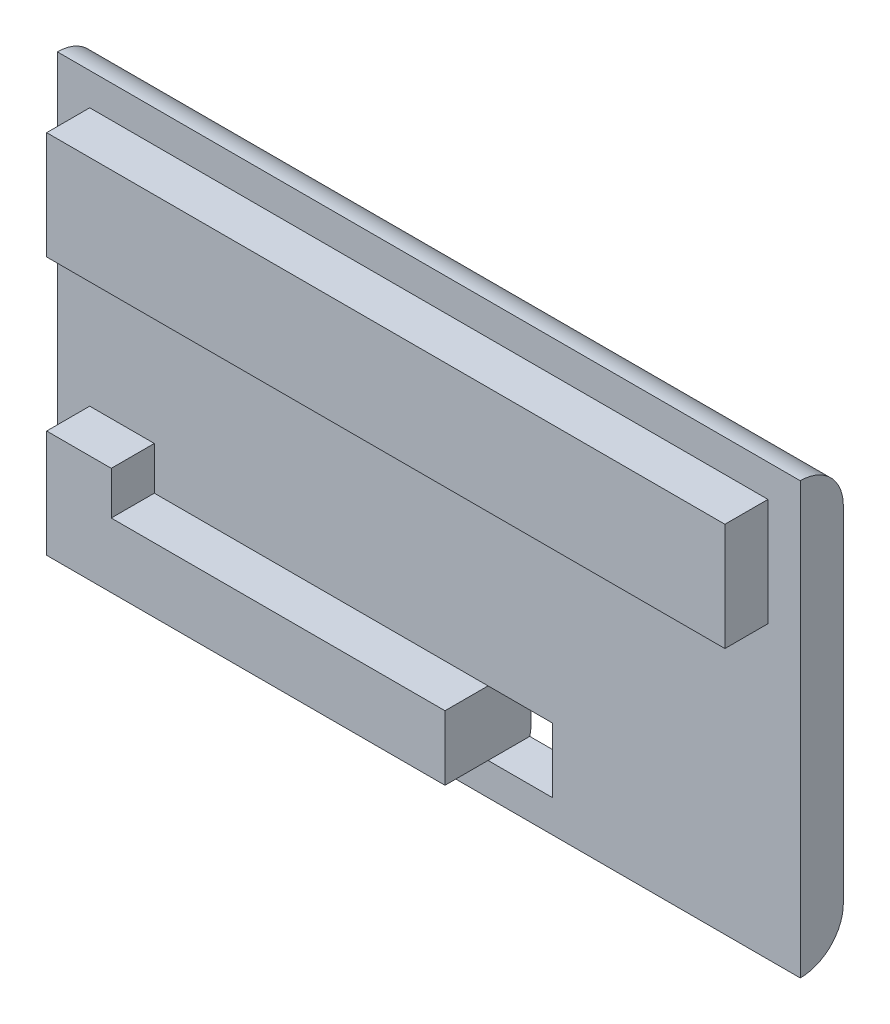
ISO-10303-21;
HEADER;
FILE_DESCRIPTION(('STEP AP214'),'2;1');
FILE_NAME('part.step','',(''),(''),'','','');
FILE_SCHEMA(('AUTOMOTIVE_DESIGN { 1 0 10303 214 1 1 1 1 }'));
ENDSEC;
DATA;
#1=APPLICATION_CONTEXT('core data for automotive mechanical design processes');
#2=APPLICATION_PROTOCOL_DEFINITION('international standard','automotive_design',2000,#1);
#3=PRODUCT_CONTEXT('',#1,'mechanical');
#4=PRODUCT('Part','Part','',(#3));
#5=PRODUCT_RELATED_PRODUCT_CATEGORY('part','',(#4));
#6=PRODUCT_DEFINITION_FORMATION('','',#4);
#7=PRODUCT_DEFINITION_CONTEXT('part definition',#1,'design');
#8=PRODUCT_DEFINITION('design','',#6,#7);
#9=PRODUCT_DEFINITION_SHAPE('','',#8);
#10=(LENGTH_UNIT() NAMED_UNIT(*) SI_UNIT(.MILLI.,.METRE.));
#11=(NAMED_UNIT(*) PLANE_ANGLE_UNIT() SI_UNIT($,.RADIAN.));
#12=(NAMED_UNIT(*) SI_UNIT($,.STERADIAN.) SOLID_ANGLE_UNIT());
#13=UNCERTAINTY_MEASURE_WITH_UNIT(LENGTH_MEASURE(1.E-05),#10,'distance_accuracy_value','');
#14=(GEOMETRIC_REPRESENTATION_CONTEXT(3) GLOBAL_UNCERTAINTY_ASSIGNED_CONTEXT((#13)) GLOBAL_UNIT_ASSIGNED_CONTEXT((#10,
#11,#12)) REPRESENTATION_CONTEXT('',''));
#15=CARTESIAN_POINT('',(0.,0.,0.));
#16=DIRECTION('',(0.,0.,1.));
#17=DIRECTION('',(1.,0.,0.));
#18=AXIS2_PLACEMENT_3D('',#15,#16,#17);
#19=CARTESIAN_POINT('',(5.75,-8.5,10.));
#20=DIRECTION('',(1.,0.,0.));
#21=DIRECTION('',(0.,1.,0.));
#22=AXIS2_PLACEMENT_3D('',#19,#20,#21);
#23=PLANE('',#22);
#24=DIRECTION('',(0.,-1.,0.));
#25=VECTOR('',#24,1.);
#26=CARTESIAN_POINT('',(5.75,-8.5,2.));
#27=LINE('',#26,#25);
#28=CARTESIAN_POINT('',(5.75,-5.5,2.));
#29=VERTEX_POINT('',#28);
#30=CARTESIAN_POINT('',(5.75,-8.5,2.));
#31=VERTEX_POINT('',#30);
#32=EDGE_CURVE('E189',#29,#31,#27,.T.);
#33=ORIENTED_EDGE('',*,*,#32,.F.);
#34=DIRECTION('',(0.,0.,-1.));
#35=VECTOR('',#34,1.);
#36=CARTESIAN_POINT('',(5.75,-5.5,10.));
#37=LINE('',#36,#35);
#38=CARTESIAN_POINT('',(5.75,-5.5,0.));
#39=VERTEX_POINT('',#38);
#40=EDGE_CURVE('E498',#29,#39,#37,.T.);
#41=ORIENTED_EDGE('',*,*,#40,.T.);
#42=DIRECTION('',(0.,-1.,0.));
#43=VECTOR('',#42,1.);
#44=CARTESIAN_POINT('',(5.75,-8.5,0.));
#45=LINE('',#44,#43);
#46=CARTESIAN_POINT('',(5.75,-8.,0.));
#47=VERTEX_POINT('',#46);
#48=EDGE_CURVE('E513',#39,#47,#45,.T.);
#49=ORIENTED_EDGE('',*,*,#48,.T.);
#50=CARTESIAN_POINT('',(5.75,-8.,2.));
#51=DIRECTION('',(1.,0.,0.));
#52=DIRECTION('',(0.,1.,0.));
#53=AXIS2_PLACEMENT_3D('',#50,#51,#52);
#54=CIRCLE('',#53,2.);
#55=CARTESIAN_POINT('',(5.75,-8.5,0.0635083268962899));
#56=VERTEX_POINT('',#55);
#57=EDGE_CURVE('E263',#47,#56,#54,.F.);
#58=ORIENTED_EDGE('',*,*,#57,.T.);
#59=DIRECTION('',(0.,0.,-1.));
#60=VECTOR('',#59,1.);
#61=CARTESIAN_POINT('',(5.75,-8.5,10.));
#62=LINE('',#61,#60);
#63=EDGE_CURVE('E493',#31,#56,#62,.T.);
#64=ORIENTED_EDGE('',*,*,#63,.F.);
#65=EDGE_LOOP('',(#33,#41,#49,#58,#64));
#66=FACE_BOUND('',#65,.T.);
#67=ADVANCED_FACE('F45',(#66),#23,.F.);
#68=CARTESIAN_POINT('',(5.75,-5.5,10.));
#69=DIRECTION('',(0.,1.,0.));
#70=DIRECTION('',(0.,0.,1.));
#71=AXIS2_PLACEMENT_3D('',#68,#69,#70);
#72=PLANE('',#71);
#73=DIRECTION('',(1.,0.,0.));
#74=VECTOR('',#73,1.);
#75=CARTESIAN_POINT('',(5.75,-5.5,2.));
#76=LINE('',#75,#74);
#77=CARTESIAN_POINT('',(2.75,-5.5,2.));
#78=VERTEX_POINT('',#77);
#79=EDGE_CURVE('E11',#78,#29,#76,.T.);
#80=ORIENTED_EDGE('',*,*,#79,.F.);
#81=DIRECTION('',(0.,0.,-1.));
#82=VECTOR('',#81,1.);
#83=CARTESIAN_POINT('',(2.75,-5.5,10.));
#84=LINE('',#83,#82);
#85=CARTESIAN_POINT('',(2.75,-5.5,0.));
#86=VERTEX_POINT('',#85);
#87=EDGE_CURVE('E519',#78,#86,#84,.T.);
#88=ORIENTED_EDGE('',*,*,#87,.T.);
#89=DIRECTION('',(1.,0.,0.));
#90=VECTOR('',#89,1.);
#91=CARTESIAN_POINT('',(5.75,-5.5,0.));
#92=LINE('',#91,#90);
#93=EDGE_CURVE('E508',#86,#39,#92,.T.);
#94=ORIENTED_EDGE('',*,*,#93,.T.);
#95=ORIENTED_EDGE('',*,*,#40,.F.);
#96=EDGE_LOOP('',(#80,#88,#94,#95));
#97=FACE_BOUND('',#96,.T.);
#98=ADVANCED_FACE('F308',(#97),#72,.F.);
#99=CARTESIAN_POINT('',(-15.75,-8.5,4.));
#100=DIRECTION('',(0.,1.,0.));
#101=DIRECTION('',(0.,0.,1.));
#102=AXIS2_PLACEMENT_3D('',#99,#100,#101);
#103=PLANE('',#102);
#104=DIRECTION('',(1.,0.,0.));
#105=VECTOR('',#104,1.);
#106=CARTESIAN_POINT('',(-15.75,-8.5,2.));
#107=LINE('',#106,#105);
#108=CARTESIAN_POINT('',(-15.75,-8.5,2.));
#109=VERTEX_POINT('',#108);
#110=CARTESIAN_POINT('',(2.75,-8.5,2.));
#111=VERTEX_POINT('',#110);
#112=EDGE_CURVE('E205',#109,#111,#107,.T.);
#113=ORIENTED_EDGE('',*,*,#112,.T.);
#114=DIRECTION('',(0.,0.,-1.));
#115=VECTOR('',#114,1.);
#116=CARTESIAN_POINT('',(2.75,-8.5,10.));
#117=LINE('',#116,#115);
#118=CARTESIAN_POINT('',(2.75,-8.5,4.));
#119=VERTEX_POINT('',#118);
#120=EDGE_CURVE('E521',#119,#111,#117,.T.);
#121=ORIENTED_EDGE('',*,*,#120,.F.);
#122=DIRECTION('',(1.,0.,0.));
#123=VECTOR('',#122,1.);
#124=CARTESIAN_POINT('',(-15.75,-8.5,4.));
#125=LINE('',#124,#123);
#126=CARTESIAN_POINT('',(-15.75,-8.5,4.));
#127=VERTEX_POINT('',#126);
#128=EDGE_CURVE('E209',#127,#119,#125,.T.);
#129=ORIENTED_EDGE('',*,*,#128,.F.);
#130=DIRECTION('',(0.,0.,-1.));
#131=VECTOR('',#130,1.);
#132=CARTESIAN_POINT('',(-15.75,-8.5,4.));
#133=LINE('',#132,#131);
#134=EDGE_CURVE('E214',#127,#109,#133,.T.);
#135=ORIENTED_EDGE('',*,*,#134,.T.);
#136=EDGE_LOOP('',(#113,#121,#129,#135));
#137=FACE_BOUND('',#136,.T.);
#138=ADVANCED_FACE('F314',(#137),#103,.F.);
#139=CARTESIAN_POINT('',(0.,0.,2.));
#140=DIRECTION('',(0.,0.,1.));
#141=DIRECTION('',(1.,0.,0.));
#142=AXIS2_PLACEMENT_3D('',#139,#140,#141);
#143=PLANE('',#142);
#144=DIRECTION('',(-1.,0.,0.));
#145=VECTOR('',#144,1.);
#146=CARTESIAN_POINT('',(-15.75,-3.5,2.));
#147=LINE('',#146,#145);
#148=CARTESIAN_POINT('',(-12.75,-3.5,2.));
#149=VERTEX_POINT('',#148);
#150=CARTESIAN_POINT('',(-15.75,-3.5,2.));
#151=VERTEX_POINT('',#150);
#152=EDGE_CURVE('E185',#149,#151,#147,.T.);
#153=ORIENTED_EDGE('',*,*,#152,.F.);
#154=DIRECTION('',(0.,-1.,0.));
#155=VECTOR('',#154,1.);
#156=CARTESIAN_POINT('',(-12.75,-3.5,2.));
#157=LINE('',#156,#155);
#158=CARTESIAN_POINT('',(-12.75,-5.5,2.));
#159=VERTEX_POINT('',#158);
#160=EDGE_CURVE('E170',#149,#159,#157,.T.);
#161=ORIENTED_EDGE('',*,*,#160,.T.);
#162=DIRECTION('',(1.,0.,0.));
#163=VECTOR('',#162,1.);
#164=CARTESIAN_POINT('',(-12.75,-5.5,2.));
#165=LINE('',#164,#163);
#166=EDGE_CURVE('E60',#159,#78,#165,.T.);
#167=ORIENTED_EDGE('',*,*,#166,.T.);
#168=ORIENTED_EDGE('',*,*,#79,.T.);
#169=ORIENTED_EDGE('',*,*,#32,.T.);
#170=DIRECTION('',(1.,0.,0.));
#171=VECTOR('',#170,1.);
#172=CARTESIAN_POINT('',(0.,-8.5,2.));
#173=LINE('',#172,#171);
#174=EDGE_CURVE('E495',#111,#31,#173,.T.);
#175=ORIENTED_EDGE('',*,*,#174,.F.);
#176=ORIENTED_EDGE('',*,*,#112,.F.);
#177=DIRECTION('',(0.,-1.,0.));
#178=VECTOR('',#177,1.);
#179=CARTESIAN_POINT('',(-15.75,-8.5,2.));
#180=LINE('',#179,#178);
#181=EDGE_CURVE('E196',#151,#109,#180,.T.);
#182=ORIENTED_EDGE('',*,*,#181,.F.);
#183=EDGE_LOOP('',(#153,#161,#167,#168,#169,#175,#176,#182));
#184=FACE_BOUND('',#183,.T.);
#185=DIRECTION('',(0.,1.,0.));
#186=VECTOR('',#185,1.);
#187=CARTESIAN_POINT('',(17.25,10.,2.));
#188=LINE('',#187,#186);
#189=CARTESIAN_POINT('',(17.25,-10.,2.));
#190=VERTEX_POINT('',#189);
#191=CARTESIAN_POINT('',(17.25,10.,2.));
#192=VERTEX_POINT('',#191);
#193=EDGE_CURVE('E219',#190,#192,#188,.T.);
#194=ORIENTED_EDGE('',*,*,#193,.T.);
#195=DIRECTION('',(-1.,0.,0.));
#196=VECTOR('',#195,1.);
#197=CARTESIAN_POINT('',(-17.25,10.,2.));
#198=LINE('',#197,#196);
#199=CARTESIAN_POINT('',(-17.25,10.,2.));
#200=VERTEX_POINT('',#199);
#201=EDGE_CURVE('E223',#192,#200,#198,.T.);
#202=ORIENTED_EDGE('',*,*,#201,.T.);
#203=DIRECTION('',(0.,-1.,0.));
#204=VECTOR('',#203,1.);
#205=CARTESIAN_POINT('',(-17.25,10.,2.));
#206=LINE('',#205,#204);
#207=CARTESIAN_POINT('',(-17.25,-10.,2.));
#208=VERTEX_POINT('',#207);
#209=EDGE_CURVE('E228',#200,#208,#206,.T.);
#210=ORIENTED_EDGE('',*,*,#209,.T.);
#211=DIRECTION('',(1.,0.,0.));
#212=VECTOR('',#211,1.);
#213=CARTESIAN_POINT('',(-17.25,-10.,2.));
#214=LINE('',#213,#212);
#215=EDGE_CURVE('E232',#208,#190,#214,.T.);
#216=ORIENTED_EDGE('',*,*,#215,.T.);
#217=EDGE_LOOP('',(#194,#202,#210,#216));
#218=FACE_BOUND('',#217,.T.);
#219=DIRECTION('',(0.,-1.,0.));
#220=VECTOR('',#219,1.);
#221=CARTESIAN_POINT('',(-15.75,8.5,2.));
#222=LINE('',#221,#220);
#223=CARTESIAN_POINT('',(-15.75,8.5,2.));
#224=VERTEX_POINT('',#223);
#225=CARTESIAN_POINT('',(-15.75,3.5,2.));
#226=VERTEX_POINT('',#225);
#227=EDGE_CURVE('E203',#224,#226,#222,.T.);
#228=ORIENTED_EDGE('',*,*,#227,.F.);
#229=DIRECTION('',(-1.,0.,0.));
#230=VECTOR('',#229,1.);
#231=CARTESIAN_POINT('',(-15.75,8.5,2.));
#232=LINE('',#231,#230);
#233=CARTESIAN_POINT('',(15.75,8.5,2.));
#234=VERTEX_POINT('',#233);
#235=EDGE_CURVE('E198',#234,#224,#232,.T.);
#236=ORIENTED_EDGE('',*,*,#235,.F.);
#237=DIRECTION('',(0.,1.,0.));
#238=VECTOR('',#237,1.);
#239=CARTESIAN_POINT('',(15.75,8.5,2.));
#240=LINE('',#239,#238);
#241=CARTESIAN_POINT('',(15.75,3.5,2.));
#242=VERTEX_POINT('',#241);
#243=EDGE_CURVE('E536',#242,#234,#240,.T.);
#244=ORIENTED_EDGE('',*,*,#243,.F.);
#245=DIRECTION('',(1.,0.,0.));
#246=VECTOR('',#245,1.);
#247=CARTESIAN_POINT('',(-15.75,3.5,2.));
#248=LINE('',#247,#246);
#249=EDGE_CURVE('E548',#226,#242,#248,.T.);
#250=ORIENTED_EDGE('',*,*,#249,.F.);
#251=EDGE_LOOP('',(#228,#236,#244,#250));
#252=FACE_BOUND('',#251,.T.);
#253=ADVANCED_FACE('F192',(#184,#218,#252),#143,.T.);
#254=CARTESIAN_POINT('',(17.25,10.,2.));
#255=DIRECTION('',(-1.,0.,0.));
#256=DIRECTION('',(0.,0.,1.));
#257=AXIS2_PLACEMENT_3D('',#254,#255,#256);
#258=PLANE('',#257);
#259=ORIENTED_EDGE('',*,*,#193,.F.);
#260=CARTESIAN_POINT('',(17.25,-8.,2.));
#261=DIRECTION('',(-1.,0.,0.));
#262=DIRECTION('',(0.,0.,1.));
#263=AXIS2_PLACEMENT_3D('',#260,#261,#262);
#264=CIRCLE('',#263,2.);
#265=CARTESIAN_POINT('',(17.25,-8.00000000000001,0.));
#266=VERTEX_POINT('',#265);
#267=EDGE_CURVE('E251',#190,#266,#264,.F.);
#268=ORIENTED_EDGE('',*,*,#267,.T.);
#269=DIRECTION('',(0.,1.,0.));
#270=VECTOR('',#269,1.);
#271=CARTESIAN_POINT('',(17.25,10.,0.));
#272=LINE('',#271,#270);
#273=CARTESIAN_POINT('',(17.25,8.,0.));
#274=VERTEX_POINT('',#273);
#275=EDGE_CURVE('E237',#266,#274,#272,.T.);
#276=ORIENTED_EDGE('',*,*,#275,.T.);
#277=CARTESIAN_POINT('',(17.25,8.,2.));
#278=DIRECTION('',(-1.,0.,0.));
#279=DIRECTION('',(0.,0.,1.));
#280=AXIS2_PLACEMENT_3D('',#277,#278,#279);
#281=CIRCLE('',#280,2.);
#282=EDGE_CURVE('E248',#274,#192,#281,.F.);
#283=ORIENTED_EDGE('',*,*,#282,.T.);
#284=EDGE_LOOP('',(#259,#268,#276,#283));
#285=FACE_BOUND('',#284,.T.);
#286=ADVANCED_FACE('F290',(#285),#258,.F.);
#287=CARTESIAN_POINT('',(-17.25,10.,2.));
#288=DIRECTION('',(1.,0.,0.));
#289=DIRECTION('',(0.,0.,-1.));
#290=AXIS2_PLACEMENT_3D('',#287,#288,#289);
#291=PLANE('',#290);
#292=DIRECTION('',(0.,-1.,0.));
#293=VECTOR('',#292,1.);
#294=CARTESIAN_POINT('',(-17.25,10.,0.));
#295=LINE('',#294,#293);
#296=CARTESIAN_POINT('',(-17.25,8.,0.));
#297=VERTEX_POINT('',#296);
#298=CARTESIAN_POINT('',(-17.25,-8.00000000000001,0.));
#299=VERTEX_POINT('',#298);
#300=EDGE_CURVE('E224',#297,#299,#295,.T.);
#301=ORIENTED_EDGE('',*,*,#300,.T.);
#302=CARTESIAN_POINT('',(-17.25,-8.,2.));
#303=DIRECTION('',(1.,0.,0.));
#304=DIRECTION('',(0.,0.,-1.));
#305=AXIS2_PLACEMENT_3D('',#302,#303,#304);
#306=CIRCLE('',#305,2.);
#307=EDGE_CURVE('E54',#299,#208,#306,.F.);
#308=ORIENTED_EDGE('',*,*,#307,.T.);
#309=ORIENTED_EDGE('',*,*,#209,.F.);
#310=CARTESIAN_POINT('',(-17.25,8.,2.));
#311=DIRECTION('',(1.,0.,0.));
#312=DIRECTION('',(0.,0.,-1.));
#313=AXIS2_PLACEMENT_3D('',#310,#311,#312);
#314=CIRCLE('',#313,2.);
#315=EDGE_CURVE('E271',#200,#297,#314,.F.);
#316=ORIENTED_EDGE('',*,*,#315,.T.);
#317=EDGE_LOOP('',(#301,#308,#309,#316));
#318=FACE_BOUND('',#317,.T.);
#319=ADVANCED_FACE('F277',(#318),#291,.F.);
#320=CARTESIAN_POINT('',(0.,0.,0.));
#321=DIRECTION('',(0.,0.,1.));
#322=DIRECTION('',(1.,0.,0.));
#323=AXIS2_PLACEMENT_3D('',#320,#321,#322);
#324=PLANE('',#323);
#325=ORIENTED_EDGE('',*,*,#275,.F.);
#326=DIRECTION('',(1.,0.,0.));
#327=VECTOR('',#326,1.);
#328=CARTESIAN_POINT('',(0.,-8.,0.));
#329=LINE('',#328,#327);
#330=EDGE_CURVE('E260',#266,#47,#329,.F.);
#331=ORIENTED_EDGE('',*,*,#330,.T.);
#332=ORIENTED_EDGE('',*,*,#48,.F.);
#333=ORIENTED_EDGE('',*,*,#93,.F.);
#334=DIRECTION('',(0.,1.,0.));
#335=VECTOR('',#334,1.);
#336=CARTESIAN_POINT('',(2.75,-8.5,0.));
#337=LINE('',#336,#335);
#338=CARTESIAN_POINT('',(2.75,-8.,0.));
#339=VERTEX_POINT('',#338);
#340=EDGE_CURVE('E504',#339,#86,#337,.T.);
#341=ORIENTED_EDGE('',*,*,#340,.F.);
#342=DIRECTION('',(1.,0.,0.));
#343=VECTOR('',#342,1.);
#344=CARTESIAN_POINT('',(0.,-8.,0.));
#345=LINE('',#344,#343);
#346=EDGE_CURVE('E257',#339,#299,#345,.F.);
#347=ORIENTED_EDGE('',*,*,#346,.T.);
#348=ORIENTED_EDGE('',*,*,#300,.F.);
#349=DIRECTION('',(-1.,0.,0.));
#350=VECTOR('',#349,1.);
#351=CARTESIAN_POINT('',(0.,8.,0.));
#352=LINE('',#351,#350);
#353=EDGE_CURVE('E254',#297,#274,#352,.F.);
#354=ORIENTED_EDGE('',*,*,#353,.T.);
#355=EDGE_LOOP('',(#325,#331,#332,#333,#341,#347,#348,#354));
#356=FACE_BOUND('',#355,.T.);
#357=ADVANCED_FACE('F293',(#356),#324,.F.);
#358=CARTESIAN_POINT('',(-15.75,-3.5,4.));
#359=DIRECTION('',(0.,-1.,0.));
#360=DIRECTION('',(0.,0.,-1.));
#361=AXIS2_PLACEMENT_3D('',#358,#359,#360);
#362=PLANE('',#361);
#363=DIRECTION('',(-1.,0.,0.));
#364=VECTOR('',#363,1.);
#365=CARTESIAN_POINT('',(-15.75,-3.5,4.));
#366=LINE('',#365,#364);
#367=CARTESIAN_POINT('',(-12.75,-3.5,4.));
#368=VERTEX_POINT('',#367);
#369=CARTESIAN_POINT('',(-15.75,-3.5,4.));
#370=VERTEX_POINT('',#369);
#371=EDGE_CURVE('E187',#368,#370,#366,.T.);
#372=ORIENTED_EDGE('',*,*,#371,.F.);
#373=DIRECTION('',(0.,0.,1.));
#374=VECTOR('',#373,1.);
#375=CARTESIAN_POINT('',(-12.75,-3.5,2.));
#376=LINE('',#375,#374);
#377=EDGE_CURVE('E174',#149,#368,#376,.T.);
#378=ORIENTED_EDGE('',*,*,#377,.F.);
#379=ORIENTED_EDGE('',*,*,#152,.T.);
#380=DIRECTION('',(0.,0.,-1.));
#381=VECTOR('',#380,1.);
#382=CARTESIAN_POINT('',(-15.75,-3.5,4.));
#383=LINE('',#382,#381);
#384=EDGE_CURVE('E530',#370,#151,#383,.T.);
#385=ORIENTED_EDGE('',*,*,#384,.F.);
#386=EDGE_LOOP('',(#372,#378,#379,#385));
#387=FACE_BOUND('',#386,.T.);
#388=ADVANCED_FACE('F183',(#387),#362,.F.);
#389=CARTESIAN_POINT('',(-15.75,-8.5,4.));
#390=DIRECTION('',(1.,0.,0.));
#391=DIRECTION('',(0.,1.,0.));
#392=AXIS2_PLACEMENT_3D('',#389,#390,#391);
#393=PLANE('',#392);
#394=ORIENTED_EDGE('',*,*,#181,.T.);
#395=ORIENTED_EDGE('',*,*,#134,.F.);
#396=DIRECTION('',(0.,-1.,0.));
#397=VECTOR('',#396,1.);
#398=CARTESIAN_POINT('',(-15.75,-8.5,4.));
#399=LINE('',#398,#397);
#400=EDGE_CURVE('E213',#370,#127,#399,.T.);
#401=ORIENTED_EDGE('',*,*,#400,.F.);
#402=ORIENTED_EDGE('',*,*,#384,.T.);
#403=EDGE_LOOP('',(#394,#395,#401,#402));
#404=FACE_BOUND('',#403,.T.);
#405=ADVANCED_FACE('F348',(#404),#393,.F.);
#406=CARTESIAN_POINT('',(0.,0.,4.));
#407=DIRECTION('',(0.,0.,-1.));
#408=DIRECTION('',(-1.,0.,0.));
#409=AXIS2_PLACEMENT_3D('',#406,#407,#408);
#410=PLANE('',#409);
#411=DIRECTION('',(0.,1.,0.));
#412=VECTOR('',#411,1.);
#413=CARTESIAN_POINT('',(2.75,0.,4.));
#414=LINE('',#413,#412);
#415=CARTESIAN_POINT('',(2.75,-5.5,4.));
#416=VERTEX_POINT('',#415);
#417=EDGE_CURVE('E236',#119,#416,#414,.T.);
#418=ORIENTED_EDGE('',*,*,#417,.T.);
#419=DIRECTION('',(1.,0.,0.));
#420=VECTOR('',#419,1.);
#421=CARTESIAN_POINT('',(-12.75,-5.5,4.));
#422=LINE('',#421,#420);
#423=CARTESIAN_POINT('',(-12.75,-5.5,4.));
#424=VERTEX_POINT('',#423);
#425=EDGE_CURVE('E179',#424,#416,#422,.T.);
#426=ORIENTED_EDGE('',*,*,#425,.F.);
#427=DIRECTION('',(0.,-1.,0.));
#428=VECTOR('',#427,1.);
#429=CARTESIAN_POINT('',(-12.75,-3.5,4.));
#430=LINE('',#429,#428);
#431=EDGE_CURVE('E581',#368,#424,#430,.T.);
#432=ORIENTED_EDGE('',*,*,#431,.F.);
#433=ORIENTED_EDGE('',*,*,#371,.T.);
#434=ORIENTED_EDGE('',*,*,#400,.T.);
#435=ORIENTED_EDGE('',*,*,#128,.T.);
#436=EDGE_LOOP('',(#418,#426,#432,#433,#434,#435));
#437=FACE_BOUND('',#436,.T.);
#438=ADVANCED_FACE('F344',(#437),#410,.F.);
#439=CARTESIAN_POINT('',(-15.75,8.5,4.));
#440=DIRECTION('',(0.,-1.,0.));
#441=DIRECTION('',(0.,0.,-1.));
#442=AXIS2_PLACEMENT_3D('',#439,#440,#441);
#443=PLANE('',#442);
#444=ORIENTED_EDGE('',*,*,#235,.T.);
#445=DIRECTION('',(0.,0.,-1.));
#446=VECTOR('',#445,1.);
#447=CARTESIAN_POINT('',(-15.75,8.5,4.));
#448=LINE('',#447,#446);
#449=CARTESIAN_POINT('',(-15.75,8.5,4.));
#450=VERTEX_POINT('',#449);
#451=EDGE_CURVE('E241',#450,#224,#448,.T.);
#452=ORIENTED_EDGE('',*,*,#451,.F.);
#453=DIRECTION('',(-1.,0.,0.));
#454=VECTOR('',#453,1.);
#455=CARTESIAN_POINT('',(-15.75,8.5,4.));
#456=LINE('',#455,#454);
#457=CARTESIAN_POINT('',(15.75,8.5,4.));
#458=VERTEX_POINT('',#457);
#459=EDGE_CURVE('E531',#458,#450,#456,.T.);
#460=ORIENTED_EDGE('',*,*,#459,.F.);
#461=DIRECTION('',(0.,0.,-1.));
#462=VECTOR('',#461,1.);
#463=CARTESIAN_POINT('',(15.75,8.5,4.));
#464=LINE('',#463,#462);
#465=EDGE_CURVE('E544',#458,#234,#464,.T.);
#466=ORIENTED_EDGE('',*,*,#465,.T.);
#467=EDGE_LOOP('',(#444,#452,#460,#466));
#468=FACE_BOUND('',#467,.T.);
#469=ADVANCED_FACE('F340',(#468),#443,.F.);
#470=CARTESIAN_POINT('',(-15.75,8.5,4.));
#471=DIRECTION('',(1.,0.,0.));
#472=DIRECTION('',(0.,0.,-1.));
#473=AXIS2_PLACEMENT_3D('',#470,#471,#472);
#474=PLANE('',#473);
#475=ORIENTED_EDGE('',*,*,#227,.T.);
#476=DIRECTION('',(0.,0.,-1.));
#477=VECTOR('',#476,1.);
#478=CARTESIAN_POINT('',(-15.75,3.5,4.));
#479=LINE('',#478,#477);
#480=CARTESIAN_POINT('',(-15.75,3.5,4.));
#481=VERTEX_POINT('',#480);
#482=EDGE_CURVE('E560',#481,#226,#479,.T.);
#483=ORIENTED_EDGE('',*,*,#482,.F.);
#484=DIRECTION('',(0.,-1.,0.));
#485=VECTOR('',#484,1.);
#486=CARTESIAN_POINT('',(-15.75,8.5,4.));
#487=LINE('',#486,#485);
#488=EDGE_CURVE('E535',#450,#481,#487,.T.);
#489=ORIENTED_EDGE('',*,*,#488,.F.);
#490=ORIENTED_EDGE('',*,*,#451,.T.);
#491=EDGE_LOOP('',(#475,#483,#489,#490));
#492=FACE_BOUND('',#491,.T.);
#493=ADVANCED_FACE('F336',(#492),#474,.F.);
#494=CARTESIAN_POINT('',(-15.75,3.5,4.));
#495=DIRECTION('',(0.,1.,0.));
#496=DIRECTION('',(0.,0.,1.));
#497=AXIS2_PLACEMENT_3D('',#494,#495,#496);
#498=PLANE('',#497);
#499=ORIENTED_EDGE('',*,*,#249,.T.);
#500=DIRECTION('',(0.,0.,-1.));
#501=VECTOR('',#500,1.);
#502=CARTESIAN_POINT('',(15.75,3.5,4.));
#503=LINE('',#502,#501);
#504=CARTESIAN_POINT('',(15.75,3.5,4.));
#505=VERTEX_POINT('',#504);
#506=EDGE_CURVE('E557',#505,#242,#503,.T.);
#507=ORIENTED_EDGE('',*,*,#506,.F.);
#508=DIRECTION('',(1.,0.,0.));
#509=VECTOR('',#508,1.);
#510=CARTESIAN_POINT('',(-15.75,3.5,4.));
#511=LINE('',#510,#509);
#512=EDGE_CURVE('E539',#481,#505,#511,.T.);
#513=ORIENTED_EDGE('',*,*,#512,.F.);
#514=ORIENTED_EDGE('',*,*,#482,.T.);
#515=EDGE_LOOP('',(#499,#507,#513,#514));
#516=FACE_BOUND('',#515,.T.);
#517=ADVANCED_FACE('F332',(#516),#498,.F.);
#518=CARTESIAN_POINT('',(15.75,8.5,4.));
#519=DIRECTION('',(-1.,0.,0.));
#520=DIRECTION('',(0.,0.,1.));
#521=AXIS2_PLACEMENT_3D('',#518,#519,#520);
#522=PLANE('',#521);
#523=ORIENTED_EDGE('',*,*,#243,.T.);
#524=ORIENTED_EDGE('',*,*,#465,.F.);
#525=DIRECTION('',(0.,1.,0.));
#526=VECTOR('',#525,1.);
#527=CARTESIAN_POINT('',(15.75,8.5,4.));
#528=LINE('',#527,#526);
#529=EDGE_CURVE('E542',#505,#458,#528,.T.);
#530=ORIENTED_EDGE('',*,*,#529,.F.);
#531=ORIENTED_EDGE('',*,*,#506,.T.);
#532=EDGE_LOOP('',(#523,#524,#530,#531));
#533=FACE_BOUND('',#532,.T.);
#534=ADVANCED_FACE('F328',(#533),#522,.F.);
#535=CARTESIAN_POINT('',(0.,0.,4.));
#536=DIRECTION('',(0.,0.,-1.));
#537=DIRECTION('',(-1.,0.,0.));
#538=AXIS2_PLACEMENT_3D('',#535,#536,#537);
#539=PLANE('',#538);
#540=ORIENTED_EDGE('',*,*,#459,.T.);
#541=ORIENTED_EDGE('',*,*,#488,.T.);
#542=ORIENTED_EDGE('',*,*,#512,.T.);
#543=ORIENTED_EDGE('',*,*,#529,.T.);
#544=EDGE_LOOP('',(#540,#541,#542,#543));
#545=FACE_BOUND('',#544,.T.);
#546=ADVANCED_FACE('F324',(#545),#539,.F.);
#547=CARTESIAN_POINT('',(2.75,-8.5,10.));
#548=DIRECTION('',(-1.,0.,0.));
#549=DIRECTION('',(0.,-1.,0.));
#550=AXIS2_PLACEMENT_3D('',#547,#548,#549);
#551=PLANE('',#550);
#552=CARTESIAN_POINT('',(2.75,-8.5,0.0635083268962899));
#553=VERTEX_POINT('',#552);
#554=EDGE_CURVE('E497',#111,#553,#117,.T.);
#555=ORIENTED_EDGE('',*,*,#554,.T.);
#556=CARTESIAN_POINT('',(2.75,-8.,2.));
#557=DIRECTION('',(-1.,0.,0.));
#558=DIRECTION('',(0.,-1.,0.));
#559=AXIS2_PLACEMENT_3D('',#556,#557,#558);
#560=CIRCLE('',#559,2.);
#561=EDGE_CURVE('E268',#553,#339,#560,.F.);
#562=ORIENTED_EDGE('',*,*,#561,.T.);
#563=ORIENTED_EDGE('',*,*,#340,.T.);
#564=ORIENTED_EDGE('',*,*,#87,.F.);
#565=EDGE_CURVE('E525',#416,#78,#84,.T.);
#566=ORIENTED_EDGE('',*,*,#565,.F.);
#567=ORIENTED_EDGE('',*,*,#417,.F.);
#568=ORIENTED_EDGE('',*,*,#120,.T.);
#569=EDGE_LOOP('',(#555,#562,#563,#564,#566,#567,#568));
#570=FACE_BOUND('',#569,.T.);
#571=ADVANCED_FACE('F321',(#570),#551,.F.);
#572=CARTESIAN_POINT('',(2.75,-8.5,10.));
#573=DIRECTION('',(0.,-1.,0.));
#574=DIRECTION('',(0.,0.,-1.));
#575=AXIS2_PLACEMENT_3D('',#572,#573,#574);
#576=PLANE('',#575);
#577=ORIENTED_EDGE('',*,*,#63,.T.);
#578=DIRECTION('',(1.,0.,0.));
#579=VECTOR('',#578,1.);
#580=CARTESIAN_POINT('',(5.75,-8.5,0.0635083268962899));
#581=LINE('',#580,#579);
#582=EDGE_CURVE('E68',#56,#553,#581,.F.);
#583=ORIENTED_EDGE('',*,*,#582,.T.);
#584=ORIENTED_EDGE('',*,*,#554,.F.);
#585=ORIENTED_EDGE('',*,*,#174,.T.);
#586=EDGE_LOOP('',(#577,#583,#584,#585));
#587=FACE_BOUND('',#586,.T.);
#588=ADVANCED_FACE('F307',(#587),#576,.F.);
#589=CARTESIAN_POINT('',(-17.25,-8.,2.));
#590=DIRECTION('',(1.,0.,0.));
#591=DIRECTION('',(0.,0.,-1.));
#592=AXIS2_PLACEMENT_3D('',#589,#590,#591);
#593=CYLINDRICAL_SURFACE('',#592,2.);
#594=ORIENTED_EDGE('',*,*,#57,.F.);
#595=ORIENTED_EDGE('',*,*,#330,.F.);
#596=ORIENTED_EDGE('',*,*,#267,.F.);
#597=ORIENTED_EDGE('',*,*,#215,.F.);
#598=ORIENTED_EDGE('',*,*,#307,.F.);
#599=ORIENTED_EDGE('',*,*,#346,.F.);
#600=ORIENTED_EDGE('',*,*,#561,.F.);
#601=ORIENTED_EDGE('',*,*,#582,.F.);
#602=EDGE_LOOP('',(#594,#595,#596,#597,#598,#599,#600,#601));
#603=FACE_BOUND('',#602,.T.);
#604=ADVANCED_FACE('F286',(#603),#593,.T.);
#605=CARTESIAN_POINT('',(-17.25,8.,2.));
#606=DIRECTION('',(-1.,0.,0.));
#607=DIRECTION('',(0.,0.,1.));
#608=AXIS2_PLACEMENT_3D('',#605,#606,#607);
#609=CYLINDRICAL_SURFACE('',#608,2.);
#610=ORIENTED_EDGE('',*,*,#282,.F.);
#611=ORIENTED_EDGE('',*,*,#353,.F.);
#612=ORIENTED_EDGE('',*,*,#315,.F.);
#613=ORIENTED_EDGE('',*,*,#201,.F.);
#614=EDGE_LOOP('',(#610,#611,#612,#613));
#615=FACE_BOUND('',#614,.T.);
#616=ADVANCED_FACE('F47',(#615),#609,.T.);
#617=CARTESIAN_POINT('',(-12.75,-5.5,2.));
#618=DIRECTION('',(0.,-1.,0.));
#619=DIRECTION('',(0.,0.,-1.));
#620=AXIS2_PLACEMENT_3D('',#617,#618,#619);
#621=PLANE('',#620);
#622=ORIENTED_EDGE('',*,*,#166,.F.);
#623=DIRECTION('',(0.,0.,1.));
#624=VECTOR('',#623,1.);
#625=CARTESIAN_POINT('',(-12.75,-5.5,2.));
#626=LINE('',#625,#624);
#627=EDGE_CURVE('E176',#159,#424,#626,.T.);
#628=ORIENTED_EDGE('',*,*,#627,.T.);
#629=ORIENTED_EDGE('',*,*,#425,.T.);
#630=ORIENTED_EDGE('',*,*,#565,.T.);
#631=EDGE_LOOP('',(#622,#628,#629,#630));
#632=FACE_BOUND('',#631,.T.);
#633=ADVANCED_FACE('F299',(#632),#621,.F.);
#634=CARTESIAN_POINT('',(-12.75,-3.5,2.));
#635=DIRECTION('',(-1.,0.,0.));
#636=DIRECTION('',(0.,0.,1.));
#637=AXIS2_PLACEMENT_3D('',#634,#635,#636);
#638=PLANE('',#637);
#639=ORIENTED_EDGE('',*,*,#431,.T.);
#640=ORIENTED_EDGE('',*,*,#627,.F.);
#641=ORIENTED_EDGE('',*,*,#160,.F.);
#642=ORIENTED_EDGE('',*,*,#377,.T.);
#643=EDGE_LOOP('',(#639,#640,#641,#642));
#644=FACE_BOUND('',#643,.T.);
#645=ADVANCED_FACE('F173',(#644),#638,.F.);
#646=CLOSED_SHELL('',(#67,#98,#138,#253,#286,#319,#357,#388,#405,#438,#469,#493,#517,#534,#546,
#571,#588,#604,#616,#633,#645));
#647=MANIFOLD_SOLID_BREP('B2',#646);
#648=ADVANCED_BREP_SHAPE_REPRESENTATION('',(#18,#647),#14);
#649=SHAPE_DEFINITION_REPRESENTATION(#9,#648);
ENDSEC;
END-ISO-10303-21;
